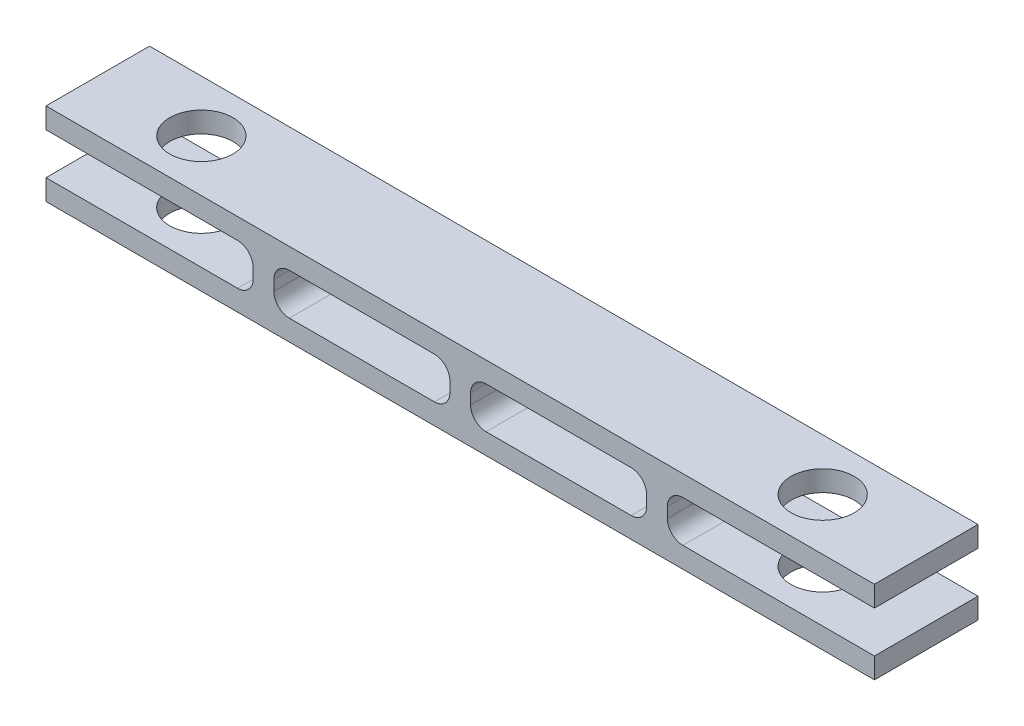
ISO-10303-21;
HEADER;
FILE_DESCRIPTION(('STEP AP214'),'2;1');
FILE_NAME('part.step','',(''),(''),'','','');
FILE_SCHEMA(('AUTOMOTIVE_DESIGN { 1 0 10303 214 1 1 1 1 }'));
ENDSEC;
DATA;
#1=APPLICATION_CONTEXT('core data for automotive mechanical design processes');
#2=APPLICATION_PROTOCOL_DEFINITION('international standard','automotive_design',2000,#1);
#3=PRODUCT_CONTEXT('',#1,'mechanical');
#4=PRODUCT('Part','Part','',(#3));
#5=PRODUCT_RELATED_PRODUCT_CATEGORY('part','',(#4));
#6=PRODUCT_DEFINITION_FORMATION('','',#4);
#7=PRODUCT_DEFINITION_CONTEXT('part definition',#1,'design');
#8=PRODUCT_DEFINITION('design','',#6,#7);
#9=PRODUCT_DEFINITION_SHAPE('','',#8);
#10=(LENGTH_UNIT() NAMED_UNIT(*) SI_UNIT(.MILLI.,.METRE.));
#11=(NAMED_UNIT(*) PLANE_ANGLE_UNIT() SI_UNIT($,.RADIAN.));
#12=(NAMED_UNIT(*) SI_UNIT($,.STERADIAN.) SOLID_ANGLE_UNIT());
#13=UNCERTAINTY_MEASURE_WITH_UNIT(LENGTH_MEASURE(1.E-05),#10,'distance_accuracy_value','');
#14=(GEOMETRIC_REPRESENTATION_CONTEXT(3) GLOBAL_UNCERTAINTY_ASSIGNED_CONTEXT((#13)) GLOBAL_UNIT_ASSIGNED_CONTEXT((#10,
#11,#12)) REPRESENTATION_CONTEXT('',''));
#15=CARTESIAN_POINT('',(0.,0.,0.));
#16=DIRECTION('',(0.,0.,1.));
#17=DIRECTION('',(1.,0.,0.));
#18=AXIS2_PLACEMENT_3D('',#15,#16,#17);
#19=CARTESIAN_POINT('',(0.,4.,0.));
#20=DIRECTION('',(1.,0.,0.));
#21=DIRECTION('',(0.,0.,-1.));
#22=AXIS2_PLACEMENT_3D('',#19,#20,#21);
#23=PLANE('',#22);
#24=DIRECTION('',(0.,-1.,0.));
#25=VECTOR('',#24,1.);
#26=CARTESIAN_POINT('',(0.,4.,-5.));
#27=LINE('',#26,#25);
#28=CARTESIAN_POINT('',(0.,4.,-5.));
#29=VERTEX_POINT('',#28);
#30=CARTESIAN_POINT('',(0.,3.,-5.));
#31=VERTEX_POINT('',#30);
#32=EDGE_CURVE('E520',#29,#31,#27,.T.);
#33=ORIENTED_EDGE('',*,*,#32,.T.);
#34=DIRECTION('',(0.,0.,-1.));
#35=VECTOR('',#34,1.);
#36=CARTESIAN_POINT('',(0.,3.,0.));
#37=LINE('',#36,#35);
#38=CARTESIAN_POINT('',(0.,3.,0.));
#39=VERTEX_POINT('',#38);
#40=EDGE_CURVE('E475',#39,#31,#37,.T.);
#41=ORIENTED_EDGE('',*,*,#40,.F.);
#42=DIRECTION('',(0.,-1.,0.));
#43=VECTOR('',#42,1.);
#44=CARTESIAN_POINT('',(0.,4.,0.));
#45=LINE('',#44,#43);
#46=CARTESIAN_POINT('',(0.,4.,0.));
#47=VERTEX_POINT('',#46);
#48=EDGE_CURVE('E281',#47,#39,#45,.T.);
#49=ORIENTED_EDGE('',*,*,#48,.F.);
#50=DIRECTION('',(0.,0.,1.));
#51=VECTOR('',#50,1.);
#52=CARTESIAN_POINT('',(0.,4.,0.));
#53=LINE('',#52,#51);
#54=EDGE_CURVE('E503',#29,#47,#53,.T.);
#55=ORIENTED_EDGE('',*,*,#54,.F.);
#56=EDGE_LOOP('',(#33,#41,#49,#55));
#57=FACE_BOUND('',#56,.T.);
#58=ADVANCED_FACE('F37',(#57),#23,.F.);
#59=CARTESIAN_POINT('',(40.,4.,0.));
#60=DIRECTION('',(-1.,0.,0.));
#61=DIRECTION('',(0.,0.,1.));
#62=AXIS2_PLACEMENT_3D('',#59,#60,#61);
#63=PLANE('',#62);
#64=DIRECTION('',(0.,-1.,0.));
#65=VECTOR('',#64,1.);
#66=CARTESIAN_POINT('',(40.,4.,0.));
#67=LINE('',#66,#65);
#68=CARTESIAN_POINT('',(40.,4.,0.));
#69=VERTEX_POINT('',#68);
#70=CARTESIAN_POINT('',(40.,3.,0.));
#71=VERTEX_POINT('',#70);
#72=EDGE_CURVE('E272',#69,#71,#67,.T.);
#73=ORIENTED_EDGE('',*,*,#72,.T.);
#74=DIRECTION('',(0.,0.,-1.));
#75=VECTOR('',#74,1.);
#76=CARTESIAN_POINT('',(40.,3.,0.));
#77=LINE('',#76,#75);
#78=CARTESIAN_POINT('',(40.,3.,-5.));
#79=VERTEX_POINT('',#78);
#80=EDGE_CURVE('E265',#71,#79,#77,.T.);
#81=ORIENTED_EDGE('',*,*,#80,.T.);
#82=DIRECTION('',(0.,-1.,0.));
#83=VECTOR('',#82,1.);
#84=CARTESIAN_POINT('',(40.,4.,-5.));
#85=LINE('',#84,#83);
#86=CARTESIAN_POINT('',(40.,4.,-5.));
#87=VERTEX_POINT('',#86);
#88=EDGE_CURVE('E273',#87,#79,#85,.T.);
#89=ORIENTED_EDGE('',*,*,#88,.F.);
#90=DIRECTION('',(0.,0.,-1.));
#91=VECTOR('',#90,1.);
#92=CARTESIAN_POINT('',(40.,4.,0.));
#93=LINE('',#92,#91);
#94=EDGE_CURVE('E509',#69,#87,#93,.T.);
#95=ORIENTED_EDGE('',*,*,#94,.F.);
#96=EDGE_LOOP('',(#73,#81,#89,#95));
#97=FACE_BOUND('',#96,.T.);
#98=ADVANCED_FACE('F554',(#97),#63,.F.);
#99=CARTESIAN_POINT('',(35.,0.,-2.5));
#100=DIRECTION('',(0.,1.,0.));
#101=DIRECTION('',(0.,0.,1.));
#102=AXIS2_PLACEMENT_3D('',#99,#100,#101);
#103=CYLINDRICAL_SURFACE('',#102,1.525);
#104=CARTESIAN_POINT('',(35.,3.,-2.5));
#105=DIRECTION('',(0.,1.,0.));
#106=DIRECTION('',(-1.,0.,0.));
#107=AXIS2_PLACEMENT_3D('',#104,#105,#106);
#108=CIRCLE('',#107,1.525);
#109=CARTESIAN_POINT('',(33.475,3.,-2.5));
#110=VERTEX_POINT('',#109);
#111=EDGE_CURVE('E294',#110,#110,#108,.F.);
#112=ORIENTED_EDGE('',*,*,#111,.T.);
#113=EDGE_LOOP('',(#112));
#114=FACE_BOUND('',#113,.T.);
#115=CARTESIAN_POINT('',(35.,4.,-2.5));
#116=DIRECTION('',(0.,1.,0.));
#117=DIRECTION('',(0.,0.,-1.));
#118=AXIS2_PLACEMENT_3D('',#115,#116,#117);
#119=CIRCLE('',#118,1.525);
#120=CARTESIAN_POINT('',(35.,4.,-4.025));
#121=VERTEX_POINT('',#120);
#122=EDGE_CURVE('E498',#121,#121,#119,.T.);
#123=ORIENTED_EDGE('',*,*,#122,.T.);
#124=EDGE_LOOP('',(#123));
#125=FACE_BOUND('',#124,.T.);
#126=ADVANCED_FACE('F548',(#114,#125),#103,.F.);
#127=CARTESIAN_POINT('',(5.,0.,-2.5));
#128=DIRECTION('',(0.,1.,0.));
#129=DIRECTION('',(0.,0.,1.));
#130=AXIS2_PLACEMENT_3D('',#127,#128,#129);
#131=CYLINDRICAL_SURFACE('',#130,1.525);
#132=CARTESIAN_POINT('',(5.,3.,-2.5));
#133=DIRECTION('',(0.,1.,0.));
#134=DIRECTION('',(-1.,0.,0.));
#135=AXIS2_PLACEMENT_3D('',#132,#133,#134);
#136=CIRCLE('',#135,1.525);
#137=CARTESIAN_POINT('',(3.475,3.,-2.5));
#138=VERTEX_POINT('',#137);
#139=EDGE_CURVE('E288',#138,#138,#136,.F.);
#140=ORIENTED_EDGE('',*,*,#139,.T.);
#141=EDGE_LOOP('',(#140));
#142=FACE_BOUND('',#141,.T.);
#143=CARTESIAN_POINT('',(5.,4.,-2.5));
#144=DIRECTION('',(0.,1.,0.));
#145=DIRECTION('',(0.,0.,1.));
#146=AXIS2_PLACEMENT_3D('',#143,#144,#145);
#147=CIRCLE('',#146,1.525);
#148=CARTESIAN_POINT('',(5.,4.,-0.975));
#149=VERTEX_POINT('',#148);
#150=EDGE_CURVE('E495',#149,#149,#147,.T.);
#151=ORIENTED_EDGE('',*,*,#150,.T.);
#152=EDGE_LOOP('',(#151));
#153=FACE_BOUND('',#152,.T.);
#154=ADVANCED_FACE('F564',(#142,#153),#131,.F.);
#155=CARTESIAN_POINT('',(0.,1.,0.));
#156=VERTEX_POINT('',#155);
#157=CARTESIAN_POINT('',(0.,0.,0.));
#158=VERTEX_POINT('',#157);
#159=EDGE_CURVE('E276',#156,#158,#45,.T.);
#160=ORIENTED_EDGE('',*,*,#159,.F.);
#161=DIRECTION('',(0.,0.,-1.));
#162=VECTOR('',#161,1.);
#163=CARTESIAN_POINT('',(0.,1.,0.));
#164=LINE('',#163,#162);
#165=CARTESIAN_POINT('',(0.,1.,-5.));
#166=VERTEX_POINT('',#165);
#167=EDGE_CURVE('E471',#156,#166,#164,.T.);
#168=ORIENTED_EDGE('',*,*,#167,.T.);
#169=CARTESIAN_POINT('',(0.,0.,-5.));
#170=VERTEX_POINT('',#169);
#171=EDGE_CURVE('E513',#166,#170,#27,.T.);
#172=ORIENTED_EDGE('',*,*,#171,.T.);
#173=DIRECTION('',(0.,0.,1.));
#174=VECTOR('',#173,1.);
#175=CARTESIAN_POINT('',(0.,0.,0.));
#176=LINE('',#175,#174);
#177=EDGE_CURVE('E494',#170,#158,#176,.T.);
#178=ORIENTED_EDGE('',*,*,#177,.T.);
#179=EDGE_LOOP('',(#160,#168,#172,#178));
#180=FACE_BOUND('',#179,.T.);
#181=ADVANCED_FACE('F529',(#180),#23,.F.);
#182=CARTESIAN_POINT('',(0.,4.,0.));
#183=DIRECTION('',(0.,0.,-1.));
#184=DIRECTION('',(-1.,0.,0.));
#185=AXIS2_PLACEMENT_3D('',#182,#183,#184);
#186=PLANE('',#185);
#187=DIRECTION('',(0.,1.,0.));
#188=VECTOR('',#187,1.);
#189=CARTESIAN_POINT('',(20.5,3.,0.));
#190=LINE('',#189,#188);
#191=CARTESIAN_POINT('',(20.5,1.75,0.));
#192=VERTEX_POINT('',#191);
#193=CARTESIAN_POINT('',(20.5,2.25,0.));
#194=VERTEX_POINT('',#193);
#195=EDGE_CURVE('E438',#192,#194,#190,.T.);
#196=ORIENTED_EDGE('',*,*,#195,.T.);
#197=CARTESIAN_POINT('',(21.25,2.25,0.));
#198=DIRECTION('',(0.,0.,-1.));
#199=DIRECTION('',(-1.,0.,0.));
#200=AXIS2_PLACEMENT_3D('',#197,#198,#199);
#201=CIRCLE('',#200,0.75);
#202=CARTESIAN_POINT('',(21.25,3.,0.));
#203=VERTEX_POINT('',#202);
#204=EDGE_CURVE('E361',#194,#203,#201,.T.);
#205=ORIENTED_EDGE('',*,*,#204,.T.);
#206=DIRECTION('',(1.,0.,0.));
#207=VECTOR('',#206,1.);
#208=CARTESIAN_POINT('',(29.,3.,0.));
#209=LINE('',#208,#207);
#210=CARTESIAN_POINT('',(28.25,3.,0.));
#211=VERTEX_POINT('',#210);
#212=EDGE_CURVE('E435',#203,#211,#209,.T.);
#213=ORIENTED_EDGE('',*,*,#212,.T.);
#214=CARTESIAN_POINT('',(28.25,2.25,0.));
#215=DIRECTION('',(0.,0.,-1.));
#216=DIRECTION('',(-1.,0.,0.));
#217=AXIS2_PLACEMENT_3D('',#214,#215,#216);
#218=CIRCLE('',#217,0.75);
#219=CARTESIAN_POINT('',(29.,2.25,0.));
#220=VERTEX_POINT('',#219);
#221=EDGE_CURVE('E373',#211,#220,#218,.T.);
#222=ORIENTED_EDGE('',*,*,#221,.T.);
#223=DIRECTION('',(0.,-1.,0.));
#224=VECTOR('',#223,1.);
#225=CARTESIAN_POINT('',(29.,3.,0.));
#226=LINE('',#225,#224);
#227=CARTESIAN_POINT('',(29.,1.75,0.));
#228=VERTEX_POINT('',#227);
#229=EDGE_CURVE('E427',#220,#228,#226,.T.);
#230=ORIENTED_EDGE('',*,*,#229,.T.);
#231=CARTESIAN_POINT('',(28.25,1.75,0.));
#232=DIRECTION('',(0.,0.,-1.));
#233=DIRECTION('',(-1.,0.,0.));
#234=AXIS2_PLACEMENT_3D('',#231,#232,#233);
#235=CIRCLE('',#234,0.75);
#236=CARTESIAN_POINT('',(28.25,1.,0.));
#237=VERTEX_POINT('',#236);
#238=EDGE_CURVE('E385',#228,#237,#235,.T.);
#239=ORIENTED_EDGE('',*,*,#238,.T.);
#240=DIRECTION('',(-1.,0.,0.));
#241=VECTOR('',#240,1.);
#242=CARTESIAN_POINT('',(29.,1.,0.));
#243=LINE('',#242,#241);
#244=CARTESIAN_POINT('',(21.25,1.,0.));
#245=VERTEX_POINT('',#244);
#246=EDGE_CURVE('E442',#237,#245,#243,.T.);
#247=ORIENTED_EDGE('',*,*,#246,.T.);
#248=CARTESIAN_POINT('',(21.25,1.75,0.));
#249=DIRECTION('',(0.,0.,-1.));
#250=DIRECTION('',(-1.,0.,0.));
#251=AXIS2_PLACEMENT_3D('',#248,#249,#250);
#252=CIRCLE('',#251,0.75);
#253=EDGE_CURVE('E393',#245,#192,#252,.T.);
#254=ORIENTED_EDGE('',*,*,#253,.T.);
#255=EDGE_LOOP('',(#196,#205,#213,#222,#230,#239,#247,#254));
#256=FACE_BOUND('',#255,.T.);
#257=DIRECTION('',(-1.,0.,0.));
#258=VECTOR('',#257,1.);
#259=CARTESIAN_POINT('',(11.,1.,0.));
#260=LINE('',#259,#258);
#261=CARTESIAN_POINT('',(18.75,1.,0.));
#262=VERTEX_POINT('',#261);
#263=CARTESIAN_POINT('',(11.75,1.,0.));
#264=VERTEX_POINT('',#263);
#265=EDGE_CURVE('E462',#262,#264,#260,.T.);
#266=ORIENTED_EDGE('',*,*,#265,.T.);
#267=CARTESIAN_POINT('',(11.75,1.75,0.));
#268=DIRECTION('',(0.,0.,-1.));
#269=DIRECTION('',(-1.,0.,0.));
#270=AXIS2_PLACEMENT_3D('',#267,#268,#269);
#271=CIRCLE('',#270,0.75);
#272=CARTESIAN_POINT('',(11.,1.75,0.));
#273=VERTEX_POINT('',#272);
#274=EDGE_CURVE('E389',#264,#273,#271,.T.);
#275=ORIENTED_EDGE('',*,*,#274,.T.);
#276=DIRECTION('',(0.,1.,0.));
#277=VECTOR('',#276,1.);
#278=CARTESIAN_POINT('',(11.,3.00000000000001,0.));
#279=LINE('',#278,#277);
#280=CARTESIAN_POINT('',(11.,2.25000000000001,0.));
#281=VERTEX_POINT('',#280);
#282=EDGE_CURVE('E459',#273,#281,#279,.T.);
#283=ORIENTED_EDGE('',*,*,#282,.T.);
#284=CARTESIAN_POINT('',(11.75,2.25000000000001,0.));
#285=DIRECTION('',(0.,0.,-1.));
#286=DIRECTION('',(-1.,0.,0.));
#287=AXIS2_PLACEMENT_3D('',#284,#285,#286);
#288=CIRCLE('',#287,0.75);
#289=CARTESIAN_POINT('',(11.75,3.00000000000001,0.));
#290=VERTEX_POINT('',#289);
#291=EDGE_CURVE('E357',#281,#290,#288,.T.);
#292=ORIENTED_EDGE('',*,*,#291,.T.);
#293=DIRECTION('',(1.,0.,0.));
#294=VECTOR('',#293,1.);
#295=CARTESIAN_POINT('',(11.,3.00000000000001,0.));
#296=LINE('',#295,#294);
#297=CARTESIAN_POINT('',(18.75,3.,0.));
#298=VERTEX_POINT('',#297);
#299=EDGE_CURVE('E451',#290,#298,#296,.T.);
#300=ORIENTED_EDGE('',*,*,#299,.T.);
#301=CARTESIAN_POINT('',(18.75,2.25,0.));
#302=DIRECTION('',(0.,0.,-1.));
#303=DIRECTION('',(-1.,0.,0.));
#304=AXIS2_PLACEMENT_3D('',#301,#302,#303);
#305=CIRCLE('',#304,0.75);
#306=CARTESIAN_POINT('',(19.5,2.25,0.));
#307=VERTEX_POINT('',#306);
#308=EDGE_CURVE('E369',#298,#307,#305,.T.);
#309=ORIENTED_EDGE('',*,*,#308,.T.);
#310=DIRECTION('',(0.,-1.,0.));
#311=VECTOR('',#310,1.);
#312=CARTESIAN_POINT('',(19.5,3.,0.));
#313=LINE('',#312,#311);
#314=CARTESIAN_POINT('',(19.5,1.75,0.));
#315=VERTEX_POINT('',#314);
#316=EDGE_CURVE('E466',#307,#315,#313,.T.);
#317=ORIENTED_EDGE('',*,*,#316,.T.);
#318=CARTESIAN_POINT('',(18.75,1.75,0.));
#319=DIRECTION('',(0.,0.,-1.));
#320=DIRECTION('',(-1.,0.,0.));
#321=AXIS2_PLACEMENT_3D('',#318,#319,#320);
#322=CIRCLE('',#321,0.75);
#323=EDGE_CURVE('E381',#315,#262,#322,.T.);
#324=ORIENTED_EDGE('',*,*,#323,.T.);
#325=EDGE_LOOP('',(#266,#275,#283,#292,#300,#309,#317,#324));
#326=FACE_BOUND('',#325,.T.);
#327=DIRECTION('',(-1.,0.,0.));
#328=VECTOR('',#327,1.);
#329=CARTESIAN_POINT('',(40.,1.,0.));
#330=LINE('',#329,#328);
#331=CARTESIAN_POINT('',(40.,1.,0.));
#332=VERTEX_POINT('',#331);
#333=CARTESIAN_POINT('',(30.75,1.,0.));
#334=VERTEX_POINT('',#333);
#335=EDGE_CURVE('E244',#332,#334,#330,.T.);
#336=ORIENTED_EDGE('',*,*,#335,.T.);
#337=CARTESIAN_POINT('',(30.75,1.75,0.));
#338=DIRECTION('',(0.,0.,-1.));
#339=DIRECTION('',(-1.,0.,0.));
#340=AXIS2_PLACEMENT_3D('',#337,#338,#339);
#341=CIRCLE('',#340,0.75);
#342=CARTESIAN_POINT('',(30.,1.75,0.));
#343=VERTEX_POINT('',#342);
#344=EDGE_CURVE('E397',#334,#343,#341,.T.);
#345=ORIENTED_EDGE('',*,*,#344,.T.);
#346=DIRECTION('',(0.,1.,0.));
#347=VECTOR('',#346,1.);
#348=CARTESIAN_POINT('',(30.,3.,0.));
#349=LINE('',#348,#347);
#350=CARTESIAN_POINT('',(30.,2.25,0.));
#351=VERTEX_POINT('',#350);
#352=EDGE_CURVE('E255',#343,#351,#349,.T.);
#353=ORIENTED_EDGE('',*,*,#352,.T.);
#354=CARTESIAN_POINT('',(30.75,2.25,0.));
#355=DIRECTION('',(0.,0.,-1.));
#356=DIRECTION('',(-1.,0.,0.));
#357=AXIS2_PLACEMENT_3D('',#354,#355,#356);
#358=CIRCLE('',#357,0.75);
#359=CARTESIAN_POINT('',(30.75,3.,0.));
#360=VERTEX_POINT('',#359);
#361=EDGE_CURVE('E11',#351,#360,#358,.T.);
#362=ORIENTED_EDGE('',*,*,#361,.T.);
#363=DIRECTION('',(1.,0.,0.));
#364=VECTOR('',#363,1.);
#365=CARTESIAN_POINT('',(40.,3.,0.));
#366=LINE('',#365,#364);
#367=EDGE_CURVE('E266',#360,#71,#366,.T.);
#368=ORIENTED_EDGE('',*,*,#367,.T.);
#369=ORIENTED_EDGE('',*,*,#72,.F.);
#370=DIRECTION('',(1.,0.,0.));
#371=VECTOR('',#370,1.);
#372=CARTESIAN_POINT('',(0.,4.,0.));
#373=LINE('',#372,#371);
#374=EDGE_CURVE('E506',#47,#69,#373,.T.);
#375=ORIENTED_EDGE('',*,*,#374,.F.);
#376=ORIENTED_EDGE('',*,*,#48,.T.);
#377=DIRECTION('',(1.,0.,0.));
#378=VECTOR('',#377,1.);
#379=CARTESIAN_POINT('',(0.,3.,0.));
#380=LINE('',#379,#378);
#381=CARTESIAN_POINT('',(9.25,3.,0.));
#382=VERTEX_POINT('',#381);
#383=EDGE_CURVE('E480',#39,#382,#380,.T.);
#384=ORIENTED_EDGE('',*,*,#383,.T.);
#385=CARTESIAN_POINT('',(9.25,2.25,0.));
#386=DIRECTION('',(0.,0.,-1.));
#387=DIRECTION('',(-1.,0.,0.));
#388=AXIS2_PLACEMENT_3D('',#385,#386,#387);
#389=CIRCLE('',#388,0.75);
#390=CARTESIAN_POINT('',(10.,2.25,0.));
#391=VERTEX_POINT('',#390);
#392=EDGE_CURVE('E365',#382,#391,#389,.T.);
#393=ORIENTED_EDGE('',*,*,#392,.T.);
#394=DIRECTION('',(0.,-1.,0.));
#395=VECTOR('',#394,1.);
#396=CARTESIAN_POINT('',(9.99999999999999,3.,0.));
#397=LINE('',#396,#395);
#398=CARTESIAN_POINT('',(10.,1.75,0.));
#399=VERTEX_POINT('',#398);
#400=EDGE_CURVE('E486',#391,#399,#397,.T.);
#401=ORIENTED_EDGE('',*,*,#400,.T.);
#402=CARTESIAN_POINT('',(9.25,1.75,0.));
#403=DIRECTION('',(0.,0.,-1.));
#404=DIRECTION('',(-1.,0.,0.));
#405=AXIS2_PLACEMENT_3D('',#402,#403,#404);
#406=CIRCLE('',#405,0.75);
#407=CARTESIAN_POINT('',(9.25,1.,0.));
#408=VERTEX_POINT('',#407);
#409=EDGE_CURVE('E377',#399,#408,#406,.T.);
#410=ORIENTED_EDGE('',*,*,#409,.T.);
#411=DIRECTION('',(-1.,0.,0.));
#412=VECTOR('',#411,1.);
#413=CARTESIAN_POINT('',(0.,1.,0.));
#414=LINE('',#413,#412);
#415=EDGE_CURVE('E474',#408,#156,#414,.T.);
#416=ORIENTED_EDGE('',*,*,#415,.T.);
#417=ORIENTED_EDGE('',*,*,#159,.T.);
#418=DIRECTION('',(1.,0.,0.));
#419=VECTOR('',#418,1.);
#420=CARTESIAN_POINT('',(0.,0.,0.));
#421=LINE('',#420,#419);
#422=CARTESIAN_POINT('',(40.,0.,0.));
#423=VERTEX_POINT('',#422);
#424=EDGE_CURVE('E270',#158,#423,#421,.T.);
#425=ORIENTED_EDGE('',*,*,#424,.T.);
#426=EDGE_CURVE('E262',#332,#423,#67,.T.);
#427=ORIENTED_EDGE('',*,*,#426,.F.);
#428=EDGE_LOOP('',(#336,#345,#353,#362,#368,#369,#375,#376,#384,#393,#401,#410,#416,#417,#425,#427));
#429=FACE_BOUND('',#428,.T.);
#430=ADVANCED_FACE('F268',(#256,#326,#429),#186,.F.);
#431=CARTESIAN_POINT('',(40.,1.,-5.));
#432=VERTEX_POINT('',#431);
#433=CARTESIAN_POINT('',(40.,0.,-5.));
#434=VERTEX_POINT('',#433);
#435=EDGE_CURVE('E264',#432,#434,#85,.T.);
#436=ORIENTED_EDGE('',*,*,#435,.F.);
#437=DIRECTION('',(0.,0.,-1.));
#438=VECTOR('',#437,1.);
#439=CARTESIAN_POINT('',(40.,1.,0.));
#440=LINE('',#439,#438);
#441=EDGE_CURVE('E249',#332,#432,#440,.T.);
#442=ORIENTED_EDGE('',*,*,#441,.F.);
#443=ORIENTED_EDGE('',*,*,#426,.T.);
#444=DIRECTION('',(0.,0.,-1.));
#445=VECTOR('',#444,1.);
#446=CARTESIAN_POINT('',(40.,0.,0.));
#447=LINE('',#446,#445);
#448=EDGE_CURVE('E517',#423,#434,#447,.T.);
#449=ORIENTED_EDGE('',*,*,#448,.T.);
#450=EDGE_LOOP('',(#436,#442,#443,#449));
#451=FACE_BOUND('',#450,.T.);
#452=ADVANCED_FACE('F260',(#451),#63,.F.);
#453=CARTESIAN_POINT('',(0.,4.,-5.));
#454=DIRECTION('',(0.,0.,1.));
#455=DIRECTION('',(1.,0.,0.));
#456=AXIS2_PLACEMENT_3D('',#453,#454,#455);
#457=PLANE('',#456);
#458=DIRECTION('',(-1.,0.,0.));
#459=VECTOR('',#458,1.);
#460=CARTESIAN_POINT('',(29.,1.,-5.));
#461=LINE('',#460,#459);
#462=CARTESIAN_POINT('',(28.25,1.,-5.));
#463=VERTEX_POINT('',#462);
#464=CARTESIAN_POINT('',(21.25,1.,-5.));
#465=VERTEX_POINT('',#464);
#466=EDGE_CURVE('E430',#463,#465,#461,.T.);
#467=ORIENTED_EDGE('',*,*,#466,.F.);
#468=CARTESIAN_POINT('',(28.25,1.75,-5.));
#469=DIRECTION('',(0.,0.,1.));
#470=DIRECTION('',(1.,0.,0.));
#471=AXIS2_PLACEMENT_3D('',#468,#469,#470);
#472=CIRCLE('',#471,0.75);
#473=CARTESIAN_POINT('',(29.,1.75,-5.));
#474=VERTEX_POINT('',#473);
#475=EDGE_CURVE('E383',#463,#474,#472,.T.);
#476=ORIENTED_EDGE('',*,*,#475,.T.);
#477=DIRECTION('',(0.,-1.,0.));
#478=VECTOR('',#477,1.);
#479=CARTESIAN_POINT('',(29.,3.,-5.));
#480=LINE('',#479,#478);
#481=CARTESIAN_POINT('',(29.,2.25,-5.));
#482=VERTEX_POINT('',#481);
#483=EDGE_CURVE('E419',#482,#474,#480,.T.);
#484=ORIENTED_EDGE('',*,*,#483,.F.);
#485=CARTESIAN_POINT('',(28.25,2.25,-5.));
#486=DIRECTION('',(0.,0.,1.));
#487=DIRECTION('',(1.,0.,0.));
#488=AXIS2_PLACEMENT_3D('',#485,#486,#487);
#489=CIRCLE('',#488,0.75);
#490=CARTESIAN_POINT('',(28.25,3.,-5.));
#491=VERTEX_POINT('',#490);
#492=EDGE_CURVE('E371',#482,#491,#489,.T.);
#493=ORIENTED_EDGE('',*,*,#492,.T.);
#494=DIRECTION('',(1.,0.,0.));
#495=VECTOR('',#494,1.);
#496=CARTESIAN_POINT('',(29.,3.,-5.));
#497=LINE('',#496,#495);
#498=CARTESIAN_POINT('',(21.25,3.,-5.));
#499=VERTEX_POINT('',#498);
#500=EDGE_CURVE('E423',#499,#491,#497,.T.);
#501=ORIENTED_EDGE('',*,*,#500,.F.);
#502=CARTESIAN_POINT('',(21.25,2.25,-5.));
#503=DIRECTION('',(0.,0.,1.));
#504=DIRECTION('',(1.,0.,0.));
#505=AXIS2_PLACEMENT_3D('',#502,#503,#504);
#506=CIRCLE('',#505,0.75);
#507=CARTESIAN_POINT('',(20.5,2.25,-5.));
#508=VERTEX_POINT('',#507);
#509=EDGE_CURVE('E359',#499,#508,#506,.T.);
#510=ORIENTED_EDGE('',*,*,#509,.T.);
#511=DIRECTION('',(0.,1.,0.));
#512=VECTOR('',#511,1.);
#513=CARTESIAN_POINT('',(20.5,3.,-5.));
#514=LINE('',#513,#512);
#515=CARTESIAN_POINT('',(20.5,1.75,-5.));
#516=VERTEX_POINT('',#515);
#517=EDGE_CURVE('E426',#516,#508,#514,.T.);
#518=ORIENTED_EDGE('',*,*,#517,.F.);
#519=CARTESIAN_POINT('',(21.25,1.75,-5.));
#520=DIRECTION('',(0.,0.,1.));
#521=DIRECTION('',(1.,0.,0.));
#522=AXIS2_PLACEMENT_3D('',#519,#520,#521);
#523=CIRCLE('',#522,0.75);
#524=EDGE_CURVE('E391',#516,#465,#523,.T.);
#525=ORIENTED_EDGE('',*,*,#524,.T.);
#526=EDGE_LOOP('',(#467,#476,#484,#493,#501,#510,#518,#525));
#527=FACE_BOUND('',#526,.T.);
#528=DIRECTION('',(0.,-1.,0.));
#529=VECTOR('',#528,1.);
#530=CARTESIAN_POINT('',(19.5,3.,-5.));
#531=LINE('',#530,#529);
#532=CARTESIAN_POINT('',(19.5,2.25,-5.));
#533=VERTEX_POINT('',#532);
#534=CARTESIAN_POINT('',(19.5,1.75,-5.));
#535=VERTEX_POINT('',#534);
#536=EDGE_CURVE('E454',#533,#535,#531,.T.);
#537=ORIENTED_EDGE('',*,*,#536,.F.);
#538=CARTESIAN_POINT('',(18.75,2.25,-5.));
#539=DIRECTION('',(0.,0.,1.));
#540=DIRECTION('',(1.,0.,0.));
#541=AXIS2_PLACEMENT_3D('',#538,#539,#540);
#542=CIRCLE('',#541,0.75);
#543=CARTESIAN_POINT('',(18.75,3.,-5.));
#544=VERTEX_POINT('',#543);
#545=EDGE_CURVE('E367',#533,#544,#542,.T.);
#546=ORIENTED_EDGE('',*,*,#545,.T.);
#547=DIRECTION('',(1.,0.,0.));
#548=VECTOR('',#547,1.);
#549=CARTESIAN_POINT('',(11.,3.00000000000001,-5.));
#550=LINE('',#549,#548);
#551=CARTESIAN_POINT('',(11.75,3.00000000000001,-5.));
#552=VERTEX_POINT('',#551);
#553=EDGE_CURVE('E439',#552,#544,#550,.T.);
#554=ORIENTED_EDGE('',*,*,#553,.F.);
#555=CARTESIAN_POINT('',(11.75,2.25000000000001,-5.));
#556=DIRECTION('',(0.,0.,1.));
#557=DIRECTION('',(1.,0.,0.));
#558=AXIS2_PLACEMENT_3D('',#555,#556,#557);
#559=CIRCLE('',#558,0.75);
#560=CARTESIAN_POINT('',(11.,2.25000000000001,-5.));
#561=VERTEX_POINT('',#560);
#562=EDGE_CURVE('E355',#552,#561,#559,.T.);
#563=ORIENTED_EDGE('',*,*,#562,.T.);
#564=DIRECTION('',(0.,1.,0.));
#565=VECTOR('',#564,1.);
#566=CARTESIAN_POINT('',(11.,3.00000000000001,-5.));
#567=LINE('',#566,#565);
#568=CARTESIAN_POINT('',(11.,1.75,-5.));
#569=VERTEX_POINT('',#568);
#570=EDGE_CURVE('E447',#569,#561,#567,.T.);
#571=ORIENTED_EDGE('',*,*,#570,.F.);
#572=CARTESIAN_POINT('',(11.75,1.75,-5.));
#573=DIRECTION('',(0.,0.,1.));
#574=DIRECTION('',(1.,0.,0.));
#575=AXIS2_PLACEMENT_3D('',#572,#573,#574);
#576=CIRCLE('',#575,0.75);
#577=CARTESIAN_POINT('',(11.75,1.,-5.));
#578=VERTEX_POINT('',#577);
#579=EDGE_CURVE('E387',#569,#578,#576,.T.);
#580=ORIENTED_EDGE('',*,*,#579,.T.);
#581=DIRECTION('',(-1.,0.,0.));
#582=VECTOR('',#581,1.);
#583=CARTESIAN_POINT('',(11.,1.,-5.));
#584=LINE('',#583,#582);
#585=CARTESIAN_POINT('',(18.75,1.,-5.));
#586=VERTEX_POINT('',#585);
#587=EDGE_CURVE('E450',#586,#578,#584,.T.);
#588=ORIENTED_EDGE('',*,*,#587,.F.);
#589=CARTESIAN_POINT('',(18.75,1.75,-5.));
#590=DIRECTION('',(0.,0.,1.));
#591=DIRECTION('',(1.,0.,0.));
#592=AXIS2_PLACEMENT_3D('',#589,#590,#591);
#593=CIRCLE('',#592,0.75);
#594=EDGE_CURVE('E379',#586,#535,#593,.T.);
#595=ORIENTED_EDGE('',*,*,#594,.T.);
#596=EDGE_LOOP('',(#537,#546,#554,#563,#571,#580,#588,#595));
#597=FACE_BOUND('',#596,.T.);
#598=ORIENTED_EDGE('',*,*,#88,.T.);
#599=DIRECTION('',(1.,0.,0.));
#600=VECTOR('',#599,1.);
#601=CARTESIAN_POINT('',(40.,3.,-5.));
#602=LINE('',#601,#600);
#603=CARTESIAN_POINT('',(30.75,3.,-5.));
#604=VERTEX_POINT('',#603);
#605=EDGE_CURVE('E256',#604,#79,#602,.T.);
#606=ORIENTED_EDGE('',*,*,#605,.F.);
#607=CARTESIAN_POINT('',(30.75,2.25,-5.));
#608=DIRECTION('',(0.,0.,1.));
#609=DIRECTION('',(1.,0.,0.));
#610=AXIS2_PLACEMENT_3D('',#607,#608,#609);
#611=CIRCLE('',#610,0.75);
#612=CARTESIAN_POINT('',(30.,2.25,-5.));
#613=VERTEX_POINT('',#612);
#614=EDGE_CURVE('E45',#604,#613,#611,.T.);
#615=ORIENTED_EDGE('',*,*,#614,.T.);
#616=DIRECTION('',(0.,1.,0.));
#617=VECTOR('',#616,1.);
#618=CARTESIAN_POINT('',(30.,3.,-5.));
#619=LINE('',#618,#617);
#620=CARTESIAN_POINT('',(30.,1.75,-5.));
#621=VERTEX_POINT('',#620);
#622=EDGE_CURVE('E403',#621,#613,#619,.T.);
#623=ORIENTED_EDGE('',*,*,#622,.F.);
#624=CARTESIAN_POINT('',(30.75,1.75,-5.));
#625=DIRECTION('',(0.,0.,1.));
#626=DIRECTION('',(1.,0.,0.));
#627=AXIS2_PLACEMENT_3D('',#624,#625,#626);
#628=CIRCLE('',#627,0.75);
#629=CARTESIAN_POINT('',(30.75,1.,-5.));
#630=VERTEX_POINT('',#629);
#631=EDGE_CURVE('E395',#621,#630,#628,.T.);
#632=ORIENTED_EDGE('',*,*,#631,.T.);
#633=DIRECTION('',(-1.,0.,0.));
#634=VECTOR('',#633,1.);
#635=CARTESIAN_POINT('',(40.,1.,-5.));
#636=LINE('',#635,#634);
#637=EDGE_CURVE('E408',#432,#630,#636,.T.);
#638=ORIENTED_EDGE('',*,*,#637,.F.);
#639=ORIENTED_EDGE('',*,*,#435,.T.);
#640=DIRECTION('',(-1.,0.,0.));
#641=VECTOR('',#640,1.);
#642=CARTESIAN_POINT('',(0.,0.,-5.));
#643=LINE('',#642,#641);
#644=EDGE_CURVE('E507',#434,#170,#643,.T.);
#645=ORIENTED_EDGE('',*,*,#644,.T.);
#646=ORIENTED_EDGE('',*,*,#171,.F.);
#647=DIRECTION('',(-1.,0.,0.));
#648=VECTOR('',#647,1.);
#649=CARTESIAN_POINT('',(0.,1.,-5.));
#650=LINE('',#649,#648);
#651=CARTESIAN_POINT('',(9.25,1.,-5.));
#652=VERTEX_POINT('',#651);
#653=EDGE_CURVE('E477',#652,#166,#650,.T.);
#654=ORIENTED_EDGE('',*,*,#653,.F.);
#655=CARTESIAN_POINT('',(9.25,1.75,-5.));
#656=DIRECTION('',(0.,0.,1.));
#657=DIRECTION('',(1.,0.,0.));
#658=AXIS2_PLACEMENT_3D('',#655,#656,#657);
#659=CIRCLE('',#658,0.75);
#660=CARTESIAN_POINT('',(10.,1.75,-5.));
#661=VERTEX_POINT('',#660);
#662=EDGE_CURVE('E375',#652,#661,#659,.T.);
#663=ORIENTED_EDGE('',*,*,#662,.T.);
#664=DIRECTION('',(0.,-1.,0.));
#665=VECTOR('',#664,1.);
#666=CARTESIAN_POINT('',(9.99999999999999,3.,-5.));
#667=LINE('',#666,#665);
#668=CARTESIAN_POINT('',(10.,2.25,-5.));
#669=VERTEX_POINT('',#668);
#670=EDGE_CURVE('E479',#669,#661,#667,.T.);
#671=ORIENTED_EDGE('',*,*,#670,.F.);
#672=CARTESIAN_POINT('',(9.25,2.25,-5.));
#673=DIRECTION('',(0.,0.,1.));
#674=DIRECTION('',(1.,0.,0.));
#675=AXIS2_PLACEMENT_3D('',#672,#673,#674);
#676=CIRCLE('',#675,0.75);
#677=CARTESIAN_POINT('',(9.25,3.,-5.));
#678=VERTEX_POINT('',#677);
#679=EDGE_CURVE('E363',#669,#678,#676,.T.);
#680=ORIENTED_EDGE('',*,*,#679,.T.);
#681=DIRECTION('',(1.,0.,0.));
#682=VECTOR('',#681,1.);
#683=CARTESIAN_POINT('',(0.,3.,-5.));
#684=LINE('',#683,#682);
#685=EDGE_CURVE('E463',#31,#678,#684,.T.);
#686=ORIENTED_EDGE('',*,*,#685,.F.);
#687=ORIENTED_EDGE('',*,*,#32,.F.);
#688=DIRECTION('',(-1.,0.,0.));
#689=VECTOR('',#688,1.);
#690=CARTESIAN_POINT('',(0.,4.,-5.));
#691=LINE('',#690,#689);
#692=EDGE_CURVE('E511',#87,#29,#691,.T.);
#693=ORIENTED_EDGE('',*,*,#692,.F.);
#694=EDGE_LOOP('',(#598,#606,#615,#623,#632,#638,#639,#645,#646,#654,#663,#671,#680,#686,#687,#693));
#695=FACE_BOUND('',#694,.T.);
#696=ADVANCED_FACE('F402',(#527,#597,#695),#457,.F.);
#697=CARTESIAN_POINT('',(0.,4.,0.));
#698=DIRECTION('',(0.,-1.,0.));
#699=DIRECTION('',(0.,0.,-1.));
#700=AXIS2_PLACEMENT_3D('',#697,#698,#699);
#701=PLANE('',#700);
#702=ORIENTED_EDGE('',*,*,#150,.F.);
#703=EDGE_LOOP('',(#702));
#704=FACE_BOUND('',#703,.T.);
#705=ORIENTED_EDGE('',*,*,#122,.F.);
#706=EDGE_LOOP('',(#705));
#707=FACE_BOUND('',#706,.T.);
#708=ORIENTED_EDGE('',*,*,#54,.T.);
#709=ORIENTED_EDGE('',*,*,#374,.T.);
#710=ORIENTED_EDGE('',*,*,#94,.T.);
#711=ORIENTED_EDGE('',*,*,#692,.T.);
#712=EDGE_LOOP('',(#708,#709,#710,#711));
#713=FACE_BOUND('',#712,.T.);
#714=ADVANCED_FACE('F538',(#704,#707,#713),#701,.F.);
#715=CARTESIAN_POINT('',(0.,0.,0.));
#716=DIRECTION('',(0.,-1.,0.));
#717=DIRECTION('',(0.,0.,-1.));
#718=AXIS2_PLACEMENT_3D('',#715,#716,#717);
#719=PLANE('',#718);
#720=CARTESIAN_POINT('',(5.,0.,-2.5));
#721=DIRECTION('',(0.,1.,0.));
#722=DIRECTION('',(0.,0.,1.));
#723=AXIS2_PLACEMENT_3D('',#720,#721,#722);
#724=CIRCLE('',#723,1.525);
#725=CARTESIAN_POINT('',(5.,0.,-0.975));
#726=VERTEX_POINT('',#725);
#727=EDGE_CURVE('E491',#726,#726,#724,.T.);
#728=ORIENTED_EDGE('',*,*,#727,.T.);
#729=EDGE_LOOP('',(#728));
#730=FACE_BOUND('',#729,.T.);
#731=CARTESIAN_POINT('',(35.,0.,-2.5));
#732=DIRECTION('',(0.,1.,0.));
#733=DIRECTION('',(0.,0.,-1.));
#734=AXIS2_PLACEMENT_3D('',#731,#732,#733);
#735=CIRCLE('',#734,1.525);
#736=CARTESIAN_POINT('',(35.,0.,-4.025));
#737=VERTEX_POINT('',#736);
#738=EDGE_CURVE('E297',#737,#737,#735,.T.);
#739=ORIENTED_EDGE('',*,*,#738,.T.);
#740=EDGE_LOOP('',(#739));
#741=FACE_BOUND('',#740,.T.);
#742=ORIENTED_EDGE('',*,*,#177,.F.);
#743=ORIENTED_EDGE('',*,*,#644,.F.);
#744=ORIENTED_EDGE('',*,*,#448,.F.);
#745=ORIENTED_EDGE('',*,*,#424,.F.);
#746=EDGE_LOOP('',(#742,#743,#744,#745));
#747=FACE_BOUND('',#746,.T.);
#748=ADVANCED_FACE('F535',(#730,#741,#747),#719,.T.);
#749=CARTESIAN_POINT('',(35.,1.,-2.5));
#750=DIRECTION('',(0.,-1.,0.));
#751=DIRECTION('',(0.,0.,-1.));
#752=AXIS2_PLACEMENT_3D('',#749,#750,#751);
#753=CIRCLE('',#752,1.525);
#754=CARTESIAN_POINT('',(35.,1.,-4.025));
#755=VERTEX_POINT('',#754);
#756=EDGE_CURVE('E291',#755,#755,#753,.F.);
#757=ORIENTED_EDGE('',*,*,#756,.T.);
#758=EDGE_LOOP('',(#757));
#759=FACE_BOUND('',#758,.T.);
#760=ORIENTED_EDGE('',*,*,#738,.F.);
#761=EDGE_LOOP('',(#760));
#762=FACE_BOUND('',#761,.T.);
#763=ADVANCED_FACE('F537',(#759,#762),#103,.F.);
#764=CARTESIAN_POINT('',(5.,1.,-2.5));
#765=DIRECTION('',(0.,-1.,0.));
#766=DIRECTION('',(0.,0.,-1.));
#767=AXIS2_PLACEMENT_3D('',#764,#765,#766);
#768=CIRCLE('',#767,1.525);
#769=CARTESIAN_POINT('',(5.,1.,-4.025));
#770=VERTEX_POINT('',#769);
#771=EDGE_CURVE('E285',#770,#770,#768,.F.);
#772=ORIENTED_EDGE('',*,*,#771,.T.);
#773=EDGE_LOOP('',(#772));
#774=FACE_BOUND('',#773,.T.);
#775=ORIENTED_EDGE('',*,*,#727,.F.);
#776=EDGE_LOOP('',(#775));
#777=FACE_BOUND('',#776,.T.);
#778=ADVANCED_FACE('F545',(#774,#777),#131,.F.);
#779=CARTESIAN_POINT('',(0.,3.,0.));
#780=DIRECTION('',(0.,1.,0.));
#781=DIRECTION('',(-1.,0.,0.));
#782=AXIS2_PLACEMENT_3D('',#779,#780,#781);
#783=PLANE('',#782);
#784=ORIENTED_EDGE('',*,*,#685,.T.);
#785=DIRECTION('',(0.,0.,-1.));
#786=VECTOR('',#785,1.);
#787=CARTESIAN_POINT('',(9.25,3.,0.));
#788=LINE('',#787,#786);
#789=EDGE_CURVE('E322',#678,#382,#788,.F.);
#790=ORIENTED_EDGE('',*,*,#789,.T.);
#791=ORIENTED_EDGE('',*,*,#383,.F.);
#792=ORIENTED_EDGE('',*,*,#40,.T.);
#793=EDGE_LOOP('',(#784,#790,#791,#792));
#794=FACE_BOUND('',#793,.T.);
#795=ORIENTED_EDGE('',*,*,#139,.F.);
#796=EDGE_LOOP('',(#795));
#797=FACE_BOUND('',#796,.T.);
#798=ADVANCED_FACE('F579',(#794,#797),#783,.F.);
#799=CARTESIAN_POINT('',(0.,1.,0.));
#800=DIRECTION('',(0.,-1.,0.));
#801=DIRECTION('',(0.,0.,-1.));
#802=AXIS2_PLACEMENT_3D('',#799,#800,#801);
#803=PLANE('',#802);
#804=ORIENTED_EDGE('',*,*,#415,.F.);
#805=DIRECTION('',(0.,0.,-1.));
#806=VECTOR('',#805,1.);
#807=CARTESIAN_POINT('',(9.25,1.,-5.));
#808=LINE('',#807,#806);
#809=EDGE_CURVE('E334',#408,#652,#808,.T.);
#810=ORIENTED_EDGE('',*,*,#809,.T.);
#811=ORIENTED_EDGE('',*,*,#653,.T.);
#812=ORIENTED_EDGE('',*,*,#167,.F.);
#813=EDGE_LOOP('',(#804,#810,#811,#812));
#814=FACE_BOUND('',#813,.T.);
#815=ORIENTED_EDGE('',*,*,#771,.F.);
#816=EDGE_LOOP('',(#815));
#817=FACE_BOUND('',#816,.T.);
#818=ADVANCED_FACE('F584',(#814,#817),#803,.F.);
#819=CARTESIAN_POINT('',(9.99999999999999,3.,0.));
#820=DIRECTION('',(1.,0.,0.));
#821=DIRECTION('',(0.,1.,0.));
#822=AXIS2_PLACEMENT_3D('',#819,#820,#821);
#823=PLANE('',#822);
#824=ORIENTED_EDGE('',*,*,#400,.F.);
#825=DIRECTION('',(0.,0.,-1.));
#826=VECTOR('',#825,1.);
#827=CARTESIAN_POINT('',(10.,2.25,-5.));
#828=LINE('',#827,#826);
#829=EDGE_CURVE('E319',#391,#669,#828,.T.);
#830=ORIENTED_EDGE('',*,*,#829,.T.);
#831=ORIENTED_EDGE('',*,*,#670,.T.);
#832=DIRECTION('',(0.,0.,-1.));
#833=VECTOR('',#832,1.);
#834=CARTESIAN_POINT('',(10.,1.75,0.));
#835=LINE('',#834,#833);
#836=EDGE_CURVE('E317',#661,#399,#835,.F.);
#837=ORIENTED_EDGE('',*,*,#836,.T.);
#838=EDGE_LOOP('',(#824,#830,#831,#837));
#839=FACE_BOUND('',#838,.T.);
#840=ADVANCED_FACE('F592',(#839),#823,.F.);
#841=CARTESIAN_POINT('',(40.,3.,0.));
#842=DIRECTION('',(0.,1.,0.));
#843=DIRECTION('',(-1.,0.,0.));
#844=AXIS2_PLACEMENT_3D('',#841,#842,#843);
#845=PLANE('',#844);
#846=ORIENTED_EDGE('',*,*,#367,.F.);
#847=DIRECTION('',(0.,0.,-1.));
#848=VECTOR('',#847,1.);
#849=CARTESIAN_POINT('',(30.75,3.,-5.));
#850=LINE('',#849,#848);
#851=EDGE_CURVE('E353',#360,#604,#850,.T.);
#852=ORIENTED_EDGE('',*,*,#851,.T.);
#853=ORIENTED_EDGE('',*,*,#605,.T.);
#854=ORIENTED_EDGE('',*,*,#80,.F.);
#855=EDGE_LOOP('',(#846,#852,#853,#854));
#856=FACE_BOUND('',#855,.T.);
#857=ORIENTED_EDGE('',*,*,#111,.F.);
#858=EDGE_LOOP('',(#857));
#859=FACE_BOUND('',#858,.T.);
#860=ADVANCED_FACE('F411',(#856,#859),#845,.F.);
#861=CARTESIAN_POINT('',(40.,1.,0.));
#862=DIRECTION('',(0.,-1.,0.));
#863=DIRECTION('',(0.,0.,-1.));
#864=AXIS2_PLACEMENT_3D('',#861,#862,#863);
#865=PLANE('',#864);
#866=ORIENTED_EDGE('',*,*,#637,.T.);
#867=DIRECTION('',(0.,0.,-1.));
#868=VECTOR('',#867,1.);
#869=CARTESIAN_POINT('',(30.75,1.,0.));
#870=LINE('',#869,#868);
#871=EDGE_CURVE('E252',#630,#334,#870,.F.);
#872=ORIENTED_EDGE('',*,*,#871,.T.);
#873=ORIENTED_EDGE('',*,*,#335,.F.);
#874=ORIENTED_EDGE('',*,*,#441,.T.);
#875=EDGE_LOOP('',(#866,#872,#873,#874));
#876=FACE_BOUND('',#875,.T.);
#877=ORIENTED_EDGE('',*,*,#756,.F.);
#878=EDGE_LOOP('',(#877));
#879=FACE_BOUND('',#878,.T.);
#880=ADVANCED_FACE('F247',(#876,#879),#865,.F.);
#881=CARTESIAN_POINT('',(30.,3.,0.));
#882=DIRECTION('',(-1.,0.,0.));
#883=DIRECTION('',(0.,-1.,0.));
#884=AXIS2_PLACEMENT_3D('',#881,#882,#883);
#885=PLANE('',#884);
#886=ORIENTED_EDGE('',*,*,#352,.F.);
#887=DIRECTION('',(0.,0.,-1.));
#888=VECTOR('',#887,1.);
#889=CARTESIAN_POINT('',(30.,1.75,-5.));
#890=LINE('',#889,#888);
#891=EDGE_CURVE('E349',#343,#621,#890,.T.);
#892=ORIENTED_EDGE('',*,*,#891,.T.);
#893=ORIENTED_EDGE('',*,*,#622,.T.);
#894=DIRECTION('',(0.,0.,-1.));
#895=VECTOR('',#894,1.);
#896=CARTESIAN_POINT('',(30.,2.25,0.));
#897=LINE('',#896,#895);
#898=EDGE_CURVE('E347',#613,#351,#897,.F.);
#899=ORIENTED_EDGE('',*,*,#898,.T.);
#900=EDGE_LOOP('',(#886,#892,#893,#899));
#901=FACE_BOUND('',#900,.T.);
#902=ADVANCED_FACE('F406',(#901),#885,.F.);
#903=CARTESIAN_POINT('',(11.,3.00000000000001,0.));
#904=DIRECTION('',(0.,1.,0.));
#905=DIRECTION('',(-1.,0.,0.));
#906=AXIS2_PLACEMENT_3D('',#903,#904,#905);
#907=PLANE('',#906);
#908=ORIENTED_EDGE('',*,*,#299,.F.);
#909=DIRECTION('',(0.,0.,-1.));
#910=VECTOR('',#909,1.);
#911=CARTESIAN_POINT('',(11.75,3.00000000000001,-5.));
#912=LINE('',#911,#910);
#913=EDGE_CURVE('E299',#290,#552,#912,.T.);
#914=ORIENTED_EDGE('',*,*,#913,.T.);
#915=ORIENTED_EDGE('',*,*,#553,.T.);
#916=DIRECTION('',(0.,0.,-1.));
#917=VECTOR('',#916,1.);
#918=CARTESIAN_POINT('',(18.75,3.,0.));
#919=LINE('',#918,#917);
#920=EDGE_CURVE('E284',#544,#298,#919,.F.);
#921=ORIENTED_EDGE('',*,*,#920,.T.);
#922=EDGE_LOOP('',(#908,#914,#915,#921));
#923=FACE_BOUND('',#922,.T.);
#924=ADVANCED_FACE('F605',(#923),#907,.F.);
#925=CARTESIAN_POINT('',(11.,3.00000000000001,0.));
#926=DIRECTION('',(-1.,0.,0.));
#927=DIRECTION('',(0.,0.,1.));
#928=AXIS2_PLACEMENT_3D('',#925,#926,#927);
#929=PLANE('',#928);
#930=ORIENTED_EDGE('',*,*,#570,.T.);
#931=DIRECTION('',(0.,0.,-1.));
#932=VECTOR('',#931,1.);
#933=CARTESIAN_POINT('',(11.,2.25000000000001,0.));
#934=LINE('',#933,#932);
#935=EDGE_CURVE('E305',#561,#281,#934,.F.);
#936=ORIENTED_EDGE('',*,*,#935,.T.);
#937=ORIENTED_EDGE('',*,*,#282,.F.);
#938=DIRECTION('',(0.,0.,-1.));
#939=VECTOR('',#938,1.);
#940=CARTESIAN_POINT('',(11.,1.75,-5.));
#941=LINE('',#940,#939);
#942=EDGE_CURVE('E302',#273,#569,#941,.T.);
#943=ORIENTED_EDGE('',*,*,#942,.T.);
#944=EDGE_LOOP('',(#930,#936,#937,#943));
#945=FACE_BOUND('',#944,.T.);
#946=ADVANCED_FACE('F601',(#945),#929,.F.);
#947=CARTESIAN_POINT('',(11.,1.,0.));
#948=DIRECTION('',(0.,-1.,0.));
#949=DIRECTION('',(1.,0.,0.));
#950=AXIS2_PLACEMENT_3D('',#947,#948,#949);
#951=PLANE('',#950);
#952=ORIENTED_EDGE('',*,*,#265,.F.);
#953=DIRECTION('',(0.,0.,-1.));
#954=VECTOR('',#953,1.);
#955=CARTESIAN_POINT('',(18.75,1.,-5.));
#956=LINE('',#955,#954);
#957=EDGE_CURVE('E339',#262,#586,#956,.T.);
#958=ORIENTED_EDGE('',*,*,#957,.T.);
#959=ORIENTED_EDGE('',*,*,#587,.T.);
#960=DIRECTION('',(0.,0.,-1.));
#961=VECTOR('',#960,1.);
#962=CARTESIAN_POINT('',(11.75,1.,0.));
#963=LINE('',#962,#961);
#964=EDGE_CURVE('E337',#578,#264,#963,.F.);
#965=ORIENTED_EDGE('',*,*,#964,.T.);
#966=EDGE_LOOP('',(#952,#958,#959,#965));
#967=FACE_BOUND('',#966,.T.);
#968=ADVANCED_FACE('F604',(#967),#951,.F.);
#969=CARTESIAN_POINT('',(19.5,3.,0.));
#970=DIRECTION('',(1.,0.,0.));
#971=DIRECTION('',(0.,0.,-1.));
#972=AXIS2_PLACEMENT_3D('',#969,#970,#971);
#973=PLANE('',#972);
#974=ORIENTED_EDGE('',*,*,#316,.F.);
#975=DIRECTION('',(0.,0.,-1.));
#976=VECTOR('',#975,1.);
#977=CARTESIAN_POINT('',(19.5,2.25,-5.));
#978=LINE('',#977,#976);
#979=EDGE_CURVE('E326',#307,#533,#978,.T.);
#980=ORIENTED_EDGE('',*,*,#979,.T.);
#981=ORIENTED_EDGE('',*,*,#536,.T.);
#982=DIRECTION('',(0.,0.,-1.));
#983=VECTOR('',#982,1.);
#984=CARTESIAN_POINT('',(19.5,1.75,0.));
#985=LINE('',#984,#983);
#986=EDGE_CURVE('E324',#535,#315,#985,.F.);
#987=ORIENTED_EDGE('',*,*,#986,.T.);
#988=EDGE_LOOP('',(#974,#980,#981,#987));
#989=FACE_BOUND('',#988,.T.);
#990=ADVANCED_FACE('F609',(#989),#973,.F.);
#991=CARTESIAN_POINT('',(29.,3.,0.));
#992=DIRECTION('',(1.,0.,0.));
#993=DIRECTION('',(0.,0.,-1.));
#994=AXIS2_PLACEMENT_3D('',#991,#992,#993);
#995=PLANE('',#994);
#996=ORIENTED_EDGE('',*,*,#229,.F.);
#997=DIRECTION('',(0.,0.,-1.));
#998=VECTOR('',#997,1.);
#999=CARTESIAN_POINT('',(29.,2.25,-5.));
#1000=LINE('',#999,#998);
#1001=EDGE_CURVE('E331',#220,#482,#1000,.T.);
#1002=ORIENTED_EDGE('',*,*,#1001,.T.);
#1003=ORIENTED_EDGE('',*,*,#483,.T.);
#1004=DIRECTION('',(0.,0.,-1.));
#1005=VECTOR('',#1004,1.);
#1006=CARTESIAN_POINT('',(29.,1.75,0.));
#1007=LINE('',#1006,#1005);
#1008=EDGE_CURVE('E329',#474,#228,#1007,.F.);
#1009=ORIENTED_EDGE('',*,*,#1008,.T.);
#1010=EDGE_LOOP('',(#996,#1002,#1003,#1009));
#1011=FACE_BOUND('',#1010,.T.);
#1012=ADVANCED_FACE('F613',(#1011),#995,.F.);
#1013=CARTESIAN_POINT('',(29.,3.,0.));
#1014=DIRECTION('',(0.,1.,0.));
#1015=DIRECTION('',(0.,0.,1.));
#1016=AXIS2_PLACEMENT_3D('',#1013,#1014,#1015);
#1017=PLANE('',#1016);
#1018=ORIENTED_EDGE('',*,*,#212,.F.);
#1019=DIRECTION('',(0.,0.,-1.));
#1020=VECTOR('',#1019,1.);
#1021=CARTESIAN_POINT('',(21.25,3.,-5.));
#1022=LINE('',#1021,#1020);
#1023=EDGE_CURVE('E309',#203,#499,#1022,.T.);
#1024=ORIENTED_EDGE('',*,*,#1023,.T.);
#1025=ORIENTED_EDGE('',*,*,#500,.T.);
#1026=DIRECTION('',(0.,0.,-1.));
#1027=VECTOR('',#1026,1.);
#1028=CARTESIAN_POINT('',(28.25,3.,0.));
#1029=LINE('',#1028,#1027);
#1030=EDGE_CURVE('E307',#491,#211,#1029,.F.);
#1031=ORIENTED_EDGE('',*,*,#1030,.T.);
#1032=EDGE_LOOP('',(#1018,#1024,#1025,#1031));
#1033=FACE_BOUND('',#1032,.T.);
#1034=ADVANCED_FACE('F618',(#1033),#1017,.F.);
#1035=CARTESIAN_POINT('',(20.5,3.,0.));
#1036=DIRECTION('',(-1.,0.,0.));
#1037=DIRECTION('',(0.,0.,1.));
#1038=AXIS2_PLACEMENT_3D('',#1035,#1036,#1037);
#1039=PLANE('',#1038);
#1040=ORIENTED_EDGE('',*,*,#517,.T.);
#1041=DIRECTION('',(0.,0.,-1.));
#1042=VECTOR('',#1041,1.);
#1043=CARTESIAN_POINT('',(20.5,2.25,0.));
#1044=LINE('',#1043,#1042);
#1045=EDGE_CURVE('E315',#508,#194,#1044,.F.);
#1046=ORIENTED_EDGE('',*,*,#1045,.T.);
#1047=ORIENTED_EDGE('',*,*,#195,.F.);
#1048=DIRECTION('',(0.,0.,-1.));
#1049=VECTOR('',#1048,1.);
#1050=CARTESIAN_POINT('',(20.5,1.75,-5.));
#1051=LINE('',#1050,#1049);
#1052=EDGE_CURVE('E312',#192,#516,#1051,.T.);
#1053=ORIENTED_EDGE('',*,*,#1052,.T.);
#1054=EDGE_LOOP('',(#1040,#1046,#1047,#1053));
#1055=FACE_BOUND('',#1054,.T.);
#1056=ADVANCED_FACE('F621',(#1055),#1039,.F.);
#1057=CARTESIAN_POINT('',(29.,1.,0.));
#1058=DIRECTION('',(0.,-1.,0.));
#1059=DIRECTION('',(0.,0.,-1.));
#1060=AXIS2_PLACEMENT_3D('',#1057,#1058,#1059);
#1061=PLANE('',#1060);
#1062=ORIENTED_EDGE('',*,*,#246,.F.);
#1063=DIRECTION('',(0.,0.,-1.));
#1064=VECTOR('',#1063,1.);
#1065=CARTESIAN_POINT('',(28.25,1.,-5.));
#1066=LINE('',#1065,#1064);
#1067=EDGE_CURVE('E344',#237,#463,#1066,.T.);
#1068=ORIENTED_EDGE('',*,*,#1067,.T.);
#1069=ORIENTED_EDGE('',*,*,#466,.T.);
#1070=DIRECTION('',(0.,0.,-1.));
#1071=VECTOR('',#1070,1.);
#1072=CARTESIAN_POINT('',(21.25,1.,0.));
#1073=LINE('',#1072,#1071);
#1074=EDGE_CURVE('E342',#465,#245,#1073,.F.);
#1075=ORIENTED_EDGE('',*,*,#1074,.T.);
#1076=EDGE_LOOP('',(#1062,#1068,#1069,#1075));
#1077=FACE_BOUND('',#1076,.T.);
#1078=ADVANCED_FACE('F625',(#1077),#1061,.F.);
#1079=CARTESIAN_POINT('',(11.75,2.25000000000001,0.));
#1080=DIRECTION('',(0.,0.,1.));
#1081=DIRECTION('',(1.,0.,0.));
#1082=AXIS2_PLACEMENT_3D('',#1079,#1080,#1081);
#1083=CYLINDRICAL_SURFACE('',#1082,0.75);
#1084=ORIENTED_EDGE('',*,*,#291,.F.);
#1085=ORIENTED_EDGE('',*,*,#935,.F.);
#1086=ORIENTED_EDGE('',*,*,#562,.F.);
#1087=ORIENTED_EDGE('',*,*,#913,.F.);
#1088=EDGE_LOOP('',(#1084,#1085,#1086,#1087));
#1089=FACE_BOUND('',#1088,.T.);
#1090=ADVANCED_FACE('F629',(#1089),#1083,.F.);
#1091=CARTESIAN_POINT('',(21.25,2.25,0.));
#1092=DIRECTION('',(0.,0.,1.));
#1093=DIRECTION('',(1.,0.,0.));
#1094=AXIS2_PLACEMENT_3D('',#1091,#1092,#1093);
#1095=CYLINDRICAL_SURFACE('',#1094,0.75);
#1096=ORIENTED_EDGE('',*,*,#204,.F.);
#1097=ORIENTED_EDGE('',*,*,#1045,.F.);
#1098=ORIENTED_EDGE('',*,*,#509,.F.);
#1099=ORIENTED_EDGE('',*,*,#1023,.F.);
#1100=EDGE_LOOP('',(#1096,#1097,#1098,#1099));
#1101=FACE_BOUND('',#1100,.T.);
#1102=ADVANCED_FACE('F689',(#1101),#1095,.F.);
#1103=CARTESIAN_POINT('',(9.25,2.25,0.));
#1104=DIRECTION('',(0.,0.,1.));
#1105=DIRECTION('',(1.,0.,0.));
#1106=AXIS2_PLACEMENT_3D('',#1103,#1104,#1105);
#1107=CYLINDRICAL_SURFACE('',#1106,0.75);
#1108=ORIENTED_EDGE('',*,*,#392,.F.);
#1109=ORIENTED_EDGE('',*,*,#789,.F.);
#1110=ORIENTED_EDGE('',*,*,#679,.F.);
#1111=ORIENTED_EDGE('',*,*,#829,.F.);
#1112=EDGE_LOOP('',(#1108,#1109,#1110,#1111));
#1113=FACE_BOUND('',#1112,.T.);
#1114=ADVANCED_FACE('F696',(#1113),#1107,.F.);
#1115=CARTESIAN_POINT('',(18.75,2.25,0.));
#1116=DIRECTION('',(0.,0.,1.));
#1117=DIRECTION('',(1.,0.,0.));
#1118=AXIS2_PLACEMENT_3D('',#1115,#1116,#1117);
#1119=CYLINDRICAL_SURFACE('',#1118,0.75);
#1120=ORIENTED_EDGE('',*,*,#308,.F.);
#1121=ORIENTED_EDGE('',*,*,#920,.F.);
#1122=ORIENTED_EDGE('',*,*,#545,.F.);
#1123=ORIENTED_EDGE('',*,*,#979,.F.);
#1124=EDGE_LOOP('',(#1120,#1121,#1122,#1123));
#1125=FACE_BOUND('',#1124,.T.);
#1126=ADVANCED_FACE('F704',(#1125),#1119,.F.);
#1127=CARTESIAN_POINT('',(28.25,2.25,0.));
#1128=DIRECTION('',(0.,0.,1.));
#1129=DIRECTION('',(1.,0.,0.));
#1130=AXIS2_PLACEMENT_3D('',#1127,#1128,#1129);
#1131=CYLINDRICAL_SURFACE('',#1130,0.75);
#1132=ORIENTED_EDGE('',*,*,#221,.F.);
#1133=ORIENTED_EDGE('',*,*,#1030,.F.);
#1134=ORIENTED_EDGE('',*,*,#492,.F.);
#1135=ORIENTED_EDGE('',*,*,#1001,.F.);
#1136=EDGE_LOOP('',(#1132,#1133,#1134,#1135));
#1137=FACE_BOUND('',#1136,.T.);
#1138=ADVANCED_FACE('F712',(#1137),#1131,.F.);
#1139=CARTESIAN_POINT('',(9.25,1.75,0.));
#1140=DIRECTION('',(0.,0.,1.));
#1141=DIRECTION('',(1.,0.,0.));
#1142=AXIS2_PLACEMENT_3D('',#1139,#1140,#1141);
#1143=CYLINDRICAL_SURFACE('',#1142,0.75);
#1144=ORIENTED_EDGE('',*,*,#409,.F.);
#1145=ORIENTED_EDGE('',*,*,#836,.F.);
#1146=ORIENTED_EDGE('',*,*,#662,.F.);
#1147=ORIENTED_EDGE('',*,*,#809,.F.);
#1148=EDGE_LOOP('',(#1144,#1145,#1146,#1147));
#1149=FACE_BOUND('',#1148,.T.);
#1150=ADVANCED_FACE('F720',(#1149),#1143,.F.);
#1151=CARTESIAN_POINT('',(18.75,1.75,0.));
#1152=DIRECTION('',(0.,0.,1.));
#1153=DIRECTION('',(1.,0.,0.));
#1154=AXIS2_PLACEMENT_3D('',#1151,#1152,#1153);
#1155=CYLINDRICAL_SURFACE('',#1154,0.75);
#1156=ORIENTED_EDGE('',*,*,#323,.F.);
#1157=ORIENTED_EDGE('',*,*,#986,.F.);
#1158=ORIENTED_EDGE('',*,*,#594,.F.);
#1159=ORIENTED_EDGE('',*,*,#957,.F.);
#1160=EDGE_LOOP('',(#1156,#1157,#1158,#1159));
#1161=FACE_BOUND('',#1160,.T.);
#1162=ADVANCED_FACE('F728',(#1161),#1155,.F.);
#1163=CARTESIAN_POINT('',(28.25,1.75,0.));
#1164=DIRECTION('',(0.,0.,1.));
#1165=DIRECTION('',(1.,0.,0.));
#1166=AXIS2_PLACEMENT_3D('',#1163,#1164,#1165);
#1167=CYLINDRICAL_SURFACE('',#1166,0.75);
#1168=ORIENTED_EDGE('',*,*,#238,.F.);
#1169=ORIENTED_EDGE('',*,*,#1008,.F.);
#1170=ORIENTED_EDGE('',*,*,#475,.F.);
#1171=ORIENTED_EDGE('',*,*,#1067,.F.);
#1172=EDGE_LOOP('',(#1168,#1169,#1170,#1171));
#1173=FACE_BOUND('',#1172,.T.);
#1174=ADVANCED_FACE('F736',(#1173),#1167,.F.);
#1175=CARTESIAN_POINT('',(11.75,1.75,0.));
#1176=DIRECTION('',(0.,0.,1.));
#1177=DIRECTION('',(1.,0.,0.));
#1178=AXIS2_PLACEMENT_3D('',#1175,#1176,#1177);
#1179=CYLINDRICAL_SURFACE('',#1178,0.75);
#1180=ORIENTED_EDGE('',*,*,#274,.F.);
#1181=ORIENTED_EDGE('',*,*,#964,.F.);
#1182=ORIENTED_EDGE('',*,*,#579,.F.);
#1183=ORIENTED_EDGE('',*,*,#942,.F.);
#1184=EDGE_LOOP('',(#1180,#1181,#1182,#1183));
#1185=FACE_BOUND('',#1184,.T.);
#1186=ADVANCED_FACE('F744',(#1185),#1179,.F.);
#1187=CARTESIAN_POINT('',(21.25,1.75,0.));
#1188=DIRECTION('',(0.,0.,1.));
#1189=DIRECTION('',(1.,0.,0.));
#1190=AXIS2_PLACEMENT_3D('',#1187,#1188,#1189);
#1191=CYLINDRICAL_SURFACE('',#1190,0.75);
#1192=ORIENTED_EDGE('',*,*,#253,.F.);
#1193=ORIENTED_EDGE('',*,*,#1074,.F.);
#1194=ORIENTED_EDGE('',*,*,#524,.F.);
#1195=ORIENTED_EDGE('',*,*,#1052,.F.);
#1196=EDGE_LOOP('',(#1192,#1193,#1194,#1195));
#1197=FACE_BOUND('',#1196,.T.);
#1198=ADVANCED_FACE('F752',(#1197),#1191,.F.);
#1199=CARTESIAN_POINT('',(30.75,1.75,0.));
#1200=DIRECTION('',(0.,0.,1.));
#1201=DIRECTION('',(1.,0.,0.));
#1202=AXIS2_PLACEMENT_3D('',#1199,#1200,#1201);
#1203=CYLINDRICAL_SURFACE('',#1202,0.75);
#1204=ORIENTED_EDGE('',*,*,#344,.F.);
#1205=ORIENTED_EDGE('',*,*,#871,.F.);
#1206=ORIENTED_EDGE('',*,*,#631,.F.);
#1207=ORIENTED_EDGE('',*,*,#891,.F.);
#1208=EDGE_LOOP('',(#1204,#1205,#1206,#1207));
#1209=FACE_BOUND('',#1208,.T.);
#1210=ADVANCED_FACE('F760',(#1209),#1203,.F.);
#1211=CARTESIAN_POINT('',(30.75,2.25,0.));
#1212=DIRECTION('',(0.,0.,1.));
#1213=DIRECTION('',(1.,0.,0.));
#1214=AXIS2_PLACEMENT_3D('',#1211,#1212,#1213);
#1215=CYLINDRICAL_SURFACE('',#1214,0.75);
#1216=ORIENTED_EDGE('',*,*,#361,.F.);
#1217=ORIENTED_EDGE('',*,*,#898,.F.);
#1218=ORIENTED_EDGE('',*,*,#614,.F.);
#1219=ORIENTED_EDGE('',*,*,#851,.F.);
#1220=EDGE_LOOP('',(#1216,#1217,#1218,#1219));
#1221=FACE_BOUND('',#1220,.T.);
#1222=ADVANCED_FACE('F39',(#1221),#1215,.F.);
#1223=CLOSED_SHELL('',(#58,#98,#126,#154,#181,#430,#452,#696,#714,#748,#763,#778,#798,#818,#840,
#860,#880,#902,#924,#946,#968,#990,#1012,#1034,#1056,#1078,#1090,#1102,#1114,#1126,#1138,#1150,
#1162,#1174,#1186,#1198,#1210,#1222));
#1224=MANIFOLD_SOLID_BREP('B2',#1223);
#1225=ADVANCED_BREP_SHAPE_REPRESENTATION('',(#18,#1224),#14);
#1226=SHAPE_DEFINITION_REPRESENTATION(#9,#1225);
ENDSEC;
END-ISO-10303-21;
